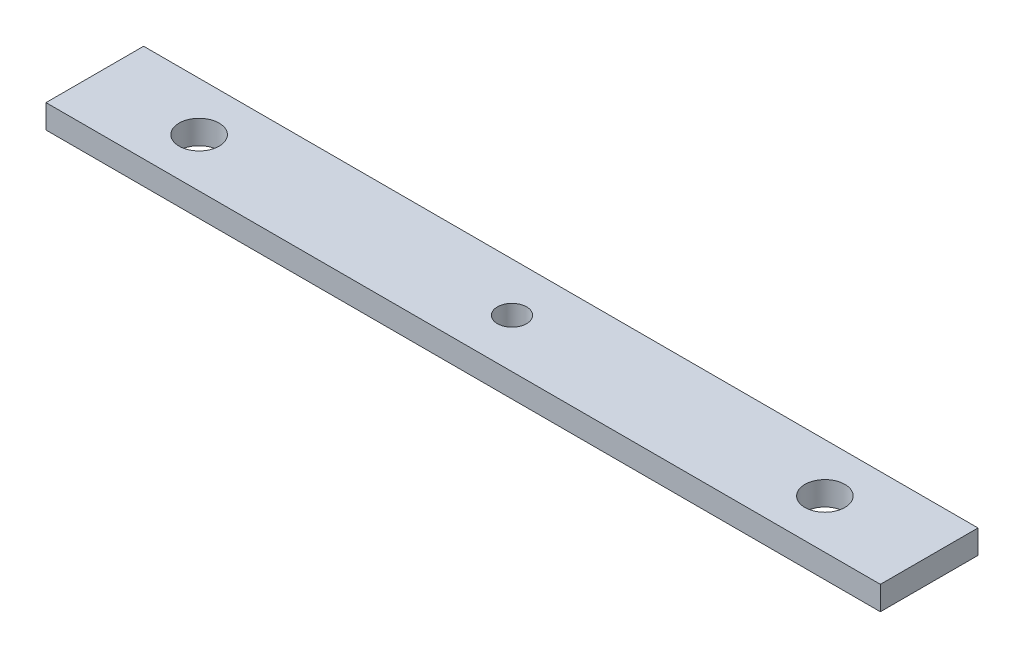
ISO-10303-21;
HEADER;
FILE_DESCRIPTION(('STEP AP214'),'2;1');
FILE_NAME('part.step','',(''),(''),'','','');
FILE_SCHEMA(('AUTOMOTIVE_DESIGN { 1 0 10303 214 1 1 1 1 }'));
ENDSEC;
DATA;
#1=APPLICATION_CONTEXT('core data for automotive mechanical design processes');
#2=APPLICATION_PROTOCOL_DEFINITION('international standard','automotive_design',2000,#1);
#3=PRODUCT_CONTEXT('',#1,'mechanical');
#4=PRODUCT('Part','Part','',(#3));
#5=PRODUCT_RELATED_PRODUCT_CATEGORY('part','',(#4));
#6=PRODUCT_DEFINITION_FORMATION('','',#4);
#7=PRODUCT_DEFINITION_CONTEXT('part definition',#1,'design');
#8=PRODUCT_DEFINITION('design','',#6,#7);
#9=PRODUCT_DEFINITION_SHAPE('','',#8);
#10=(LENGTH_UNIT() NAMED_UNIT(*) SI_UNIT(.MILLI.,.METRE.));
#11=(NAMED_UNIT(*) PLANE_ANGLE_UNIT() SI_UNIT($,.RADIAN.));
#12=(NAMED_UNIT(*) SI_UNIT($,.STERADIAN.) SOLID_ANGLE_UNIT());
#13=UNCERTAINTY_MEASURE_WITH_UNIT(LENGTH_MEASURE(1.E-05),#10,'distance_accuracy_value','');
#14=(GEOMETRIC_REPRESENTATION_CONTEXT(3) GLOBAL_UNCERTAINTY_ASSIGNED_CONTEXT((#13)) GLOBAL_UNIT_ASSIGNED_CONTEXT((#10,
#11,#12)) REPRESENTATION_CONTEXT('',''));
#15=CARTESIAN_POINT('',(0.,0.,0.));
#16=DIRECTION('',(0.,0.,1.));
#17=DIRECTION('',(1.,0.,0.));
#18=AXIS2_PLACEMENT_3D('',#15,#16,#17);
#19=CARTESIAN_POINT('',(50.,2.85,-5.85));
#20=DIRECTION('',(-1.,0.,0.));
#21=DIRECTION('',(0.,0.,1.));
#22=AXIS2_PLACEMENT_3D('',#19,#20,#21);
#23=PLANE('',#22);
#24=DIRECTION('',(0.,0.,-1.));
#25=VECTOR('',#24,1.);
#26=CARTESIAN_POINT('',(50.,0.,-5.85));
#27=LINE('',#26,#25);
#28=CARTESIAN_POINT('',(50.,0.,5.85));
#29=VERTEX_POINT('',#28);
#30=CARTESIAN_POINT('',(50.,0.,-5.85));
#31=VERTEX_POINT('',#30);
#32=EDGE_CURVE('E99',#29,#31,#27,.T.);
#33=ORIENTED_EDGE('',*,*,#32,.T.);
#34=DIRECTION('',(0.,-1.,0.));
#35=VECTOR('',#34,1.);
#36=CARTESIAN_POINT('',(50.,2.85,-5.85));
#37=LINE('',#36,#35);
#38=CARTESIAN_POINT('',(50.,2.85,-5.85));
#39=VERTEX_POINT('',#38);
#40=EDGE_CURVE('E11',#39,#31,#37,.T.);
#41=ORIENTED_EDGE('',*,*,#40,.F.);
#42=DIRECTION('',(0.,0.,-1.));
#43=VECTOR('',#42,1.);
#44=CARTESIAN_POINT('',(50.,2.85,-5.85));
#45=LINE('',#44,#43);
#46=CARTESIAN_POINT('',(50.,2.85,5.85));
#47=VERTEX_POINT('',#46);
#48=EDGE_CURVE('E86',#47,#39,#45,.T.);
#49=ORIENTED_EDGE('',*,*,#48,.F.);
#50=DIRECTION('',(0.,-1.,0.));
#51=VECTOR('',#50,1.);
#52=CARTESIAN_POINT('',(50.,2.85,5.85));
#53=LINE('',#52,#51);
#54=EDGE_CURVE('E95',#47,#29,#53,.T.);
#55=ORIENTED_EDGE('',*,*,#54,.T.);
#56=EDGE_LOOP('',(#33,#41,#49,#55));
#57=FACE_BOUND('',#56,.T.);
#58=ADVANCED_FACE('F33',(#57),#23,.F.);
#59=CARTESIAN_POINT('',(-50.,2.85,-5.85));
#60=DIRECTION('',(0.,0.,1.));
#61=DIRECTION('',(1.,0.,0.));
#62=AXIS2_PLACEMENT_3D('',#59,#60,#61);
#63=PLANE('',#62);
#64=DIRECTION('',(-1.,0.,0.));
#65=VECTOR('',#64,1.);
#66=CARTESIAN_POINT('',(-50.,0.,-5.85));
#67=LINE('',#66,#65);
#68=CARTESIAN_POINT('',(-50.,0.,-5.85));
#69=VERTEX_POINT('',#68);
#70=EDGE_CURVE('E90',#31,#69,#67,.T.);
#71=ORIENTED_EDGE('',*,*,#70,.T.);
#72=DIRECTION('',(0.,-1.,0.));
#73=VECTOR('',#72,1.);
#74=CARTESIAN_POINT('',(-50.,2.85,-5.85));
#75=LINE('',#74,#73);
#76=CARTESIAN_POINT('',(-50.,2.85,-5.85));
#77=VERTEX_POINT('',#76);
#78=EDGE_CURVE('E42',#77,#69,#75,.T.);
#79=ORIENTED_EDGE('',*,*,#78,.F.);
#80=DIRECTION('',(-1.,0.,0.));
#81=VECTOR('',#80,1.);
#82=CARTESIAN_POINT('',(-50.,2.85,-5.85));
#83=LINE('',#82,#81);
#84=EDGE_CURVE('E81',#39,#77,#83,.T.);
#85=ORIENTED_EDGE('',*,*,#84,.F.);
#86=ORIENTED_EDGE('',*,*,#40,.T.);
#87=EDGE_LOOP('',(#71,#79,#85,#86));
#88=FACE_BOUND('',#87,.T.);
#89=ADVANCED_FACE('F89',(#88),#63,.F.);
#90=CARTESIAN_POINT('',(-50.,2.85,-5.85));
#91=DIRECTION('',(1.,0.,0.));
#92=DIRECTION('',(0.,0.,-1.));
#93=AXIS2_PLACEMENT_3D('',#90,#91,#92);
#94=PLANE('',#93);
#95=DIRECTION('',(0.,0.,1.));
#96=VECTOR('',#95,1.);
#97=CARTESIAN_POINT('',(-50.,0.,-5.85));
#98=LINE('',#97,#96);
#99=CARTESIAN_POINT('',(-50.,0.,5.85));
#100=VERTEX_POINT('',#99);
#101=EDGE_CURVE('E68',#69,#100,#98,.T.);
#102=ORIENTED_EDGE('',*,*,#101,.T.);
#103=DIRECTION('',(0.,-1.,0.));
#104=VECTOR('',#103,1.);
#105=CARTESIAN_POINT('',(-50.,2.85,5.85));
#106=LINE('',#105,#104);
#107=CARTESIAN_POINT('',(-50.,2.85,5.85));
#108=VERTEX_POINT('',#107);
#109=EDGE_CURVE('E91',#108,#100,#106,.T.);
#110=ORIENTED_EDGE('',*,*,#109,.F.);
#111=DIRECTION('',(0.,0.,1.));
#112=VECTOR('',#111,1.);
#113=CARTESIAN_POINT('',(-50.,2.85,-5.85));
#114=LINE('',#113,#112);
#115=EDGE_CURVE('E84',#77,#108,#114,.T.);
#116=ORIENTED_EDGE('',*,*,#115,.F.);
#117=ORIENTED_EDGE('',*,*,#78,.T.);
#118=EDGE_LOOP('',(#102,#110,#116,#117));
#119=FACE_BOUND('',#118,.T.);
#120=ADVANCED_FACE('F93',(#119),#94,.F.);
#121=CARTESIAN_POINT('',(-50.,2.85,5.85));
#122=DIRECTION('',(0.,0.,-1.));
#123=DIRECTION('',(-1.,0.,0.));
#124=AXIS2_PLACEMENT_3D('',#121,#122,#123);
#125=PLANE('',#124);
#126=DIRECTION('',(1.,0.,0.));
#127=VECTOR('',#126,1.);
#128=CARTESIAN_POINT('',(-50.,0.,5.85));
#129=LINE('',#128,#127);
#130=EDGE_CURVE('E74',#100,#29,#129,.T.);
#131=ORIENTED_EDGE('',*,*,#130,.T.);
#132=ORIENTED_EDGE('',*,*,#54,.F.);
#133=DIRECTION('',(1.,0.,0.));
#134=VECTOR('',#133,1.);
#135=CARTESIAN_POINT('',(-50.,2.85,5.85));
#136=LINE('',#135,#134);
#137=EDGE_CURVE('E51',#108,#47,#136,.T.);
#138=ORIENTED_EDGE('',*,*,#137,.F.);
#139=ORIENTED_EDGE('',*,*,#109,.T.);
#140=EDGE_LOOP('',(#131,#132,#138,#139));
#141=FACE_BOUND('',#140,.T.);
#142=ADVANCED_FACE('F137',(#141),#125,.F.);
#143=CARTESIAN_POINT('',(0.,2.85,0.));
#144=DIRECTION('',(0.,1.,0.));
#145=DIRECTION('',(0.,0.,1.));
#146=AXIS2_PLACEMENT_3D('',#143,#144,#145);
#147=PLANE('',#146);
#148=CARTESIAN_POINT('',(37.5,2.85,0.));
#149=DIRECTION('',(0.,-1.,0.));
#150=DIRECTION('',(0.,0.,-1.));
#151=AXIS2_PLACEMENT_3D('',#148,#149,#150);
#152=CIRCLE('',#151,2.4);
#153=CARTESIAN_POINT('',(37.5,2.85,-2.4));
#154=VERTEX_POINT('',#153);
#155=EDGE_CURVE('E120',#154,#154,#152,.T.);
#156=ORIENTED_EDGE('',*,*,#155,.T.);
#157=EDGE_LOOP('',(#156));
#158=FACE_BOUND('',#157,.T.);
#159=CARTESIAN_POINT('',(-37.5,2.85,0.));
#160=DIRECTION('',(0.,-1.,0.));
#161=DIRECTION('',(0.,0.,-1.));
#162=AXIS2_PLACEMENT_3D('',#159,#160,#161);
#163=CIRCLE('',#162,2.4);
#164=CARTESIAN_POINT('',(-37.5,2.85,-2.4));
#165=VERTEX_POINT('',#164);
#166=EDGE_CURVE('E110',#165,#165,#163,.T.);
#167=ORIENTED_EDGE('',*,*,#166,.T.);
#168=EDGE_LOOP('',(#167));
#169=FACE_BOUND('',#168,.T.);
#170=CARTESIAN_POINT('',(0.,2.85,0.));
#171=DIRECTION('',(0.,1.,0.));
#172=DIRECTION('',(0.,0.,1.));
#173=AXIS2_PLACEMENT_3D('',#170,#171,#172);
#174=CIRCLE('',#173,1.75);
#175=CARTESIAN_POINT('',(0.,2.85,1.75));
#176=VERTEX_POINT('',#175);
#177=EDGE_CURVE('E109',#176,#176,#174,.T.);
#178=ORIENTED_EDGE('',*,*,#177,.F.);
#179=EDGE_LOOP('',(#178));
#180=FACE_BOUND('',#179,.T.);
#181=ORIENTED_EDGE('',*,*,#48,.T.);
#182=ORIENTED_EDGE('',*,*,#84,.T.);
#183=ORIENTED_EDGE('',*,*,#115,.T.);
#184=ORIENTED_EDGE('',*,*,#137,.T.);
#185=EDGE_LOOP('',(#181,#182,#183,#184));
#186=FACE_BOUND('',#185,.T.);
#187=ADVANCED_FACE('F82',(#158,#169,#180,#186),#147,.T.);
#188=CARTESIAN_POINT('',(0.,0.,0.));
#189=DIRECTION('',(0.,1.,0.));
#190=DIRECTION('',(0.,0.,1.));
#191=AXIS2_PLACEMENT_3D('',#188,#189,#190);
#192=PLANE('',#191);
#193=CARTESIAN_POINT('',(37.5,0.,0.));
#194=DIRECTION('',(0.,1.,0.));
#195=DIRECTION('',(0.,0.,1.));
#196=AXIS2_PLACEMENT_3D('',#193,#194,#195);
#197=CIRCLE('',#196,2.4);
#198=CARTESIAN_POINT('',(37.5,0.,2.4));
#199=VERTEX_POINT('',#198);
#200=EDGE_CURVE('E36',#199,#199,#197,.T.);
#201=ORIENTED_EDGE('',*,*,#200,.T.);
#202=EDGE_LOOP('',(#201));
#203=FACE_BOUND('',#202,.T.);
#204=CARTESIAN_POINT('',(-37.5,0.,0.));
#205=DIRECTION('',(0.,1.,0.));
#206=DIRECTION('',(0.,0.,1.));
#207=AXIS2_PLACEMENT_3D('',#204,#205,#206);
#208=CIRCLE('',#207,2.4);
#209=CARTESIAN_POINT('',(-37.5,0.,2.4));
#210=VERTEX_POINT('',#209);
#211=EDGE_CURVE('E107',#210,#210,#208,.T.);
#212=ORIENTED_EDGE('',*,*,#211,.T.);
#213=EDGE_LOOP('',(#212));
#214=FACE_BOUND('',#213,.T.);
#215=CARTESIAN_POINT('',(0.,0.,0.));
#216=DIRECTION('',(0.,1.,0.));
#217=DIRECTION('',(0.,0.,1.));
#218=AXIS2_PLACEMENT_3D('',#215,#216,#217);
#219=CIRCLE('',#218,1.75);
#220=CARTESIAN_POINT('',(0.,0.,1.75));
#221=VERTEX_POINT('',#220);
#222=EDGE_CURVE('E102',#221,#221,#219,.T.);
#223=ORIENTED_EDGE('',*,*,#222,.T.);
#224=EDGE_LOOP('',(#223));
#225=FACE_BOUND('',#224,.T.);
#226=ORIENTED_EDGE('',*,*,#32,.F.);
#227=ORIENTED_EDGE('',*,*,#130,.F.);
#228=ORIENTED_EDGE('',*,*,#101,.F.);
#229=ORIENTED_EDGE('',*,*,#70,.F.);
#230=EDGE_LOOP('',(#226,#227,#228,#229));
#231=FACE_BOUND('',#230,.T.);
#232=ADVANCED_FACE('F126',(#203,#214,#225,#231),#192,.F.);
#233=CARTESIAN_POINT('',(0.,0.,0.));
#234=DIRECTION('',(0.,1.,0.));
#235=DIRECTION('',(0.,0.,1.));
#236=AXIS2_PLACEMENT_3D('',#233,#234,#235);
#237=CYLINDRICAL_SURFACE('',#236,1.75);
#238=ORIENTED_EDGE('',*,*,#222,.F.);
#239=EDGE_LOOP('',(#238));
#240=FACE_BOUND('',#239,.T.);
#241=ORIENTED_EDGE('',*,*,#177,.T.);
#242=EDGE_LOOP('',(#241));
#243=FACE_BOUND('',#242,.T.);
#244=ADVANCED_FACE('F129',(#240,#243),#237,.F.);
#245=CARTESIAN_POINT('',(-37.5,2.85,0.));
#246=DIRECTION('',(0.,-1.,0.));
#247=DIRECTION('',(0.,0.,-1.));
#248=AXIS2_PLACEMENT_3D('',#245,#246,#247);
#249=CYLINDRICAL_SURFACE('',#248,2.4);
#250=ORIENTED_EDGE('',*,*,#166,.F.);
#251=EDGE_LOOP('',(#250));
#252=FACE_BOUND('',#251,.T.);
#253=ORIENTED_EDGE('',*,*,#211,.F.);
#254=EDGE_LOOP('',(#253));
#255=FACE_BOUND('',#254,.T.);
#256=ADVANCED_FACE('F132',(#252,#255),#249,.F.);
#257=CARTESIAN_POINT('',(37.5,2.85,0.));
#258=DIRECTION('',(0.,-1.,0.));
#259=DIRECTION('',(0.,0.,-1.));
#260=AXIS2_PLACEMENT_3D('',#257,#258,#259);
#261=CYLINDRICAL_SURFACE('',#260,2.4);
#262=ORIENTED_EDGE('',*,*,#155,.F.);
#263=EDGE_LOOP('',(#262));
#264=FACE_BOUND('',#263,.T.);
#265=ORIENTED_EDGE('',*,*,#200,.F.);
#266=EDGE_LOOP('',(#265));
#267=FACE_BOUND('',#266,.T.);
#268=ADVANCED_FACE('F189',(#264,#267),#261,.F.);
#269=CLOSED_SHELL('',(#58,#89,#120,#142,#187,#232,#244,#256,#268));
#270=MANIFOLD_SOLID_BREP('B2',#269);
#271=ADVANCED_BREP_SHAPE_REPRESENTATION('',(#18,#270),#14);
#272=SHAPE_DEFINITION_REPRESENTATION(#9,#271);
ENDSEC;
END-ISO-10303-21;
